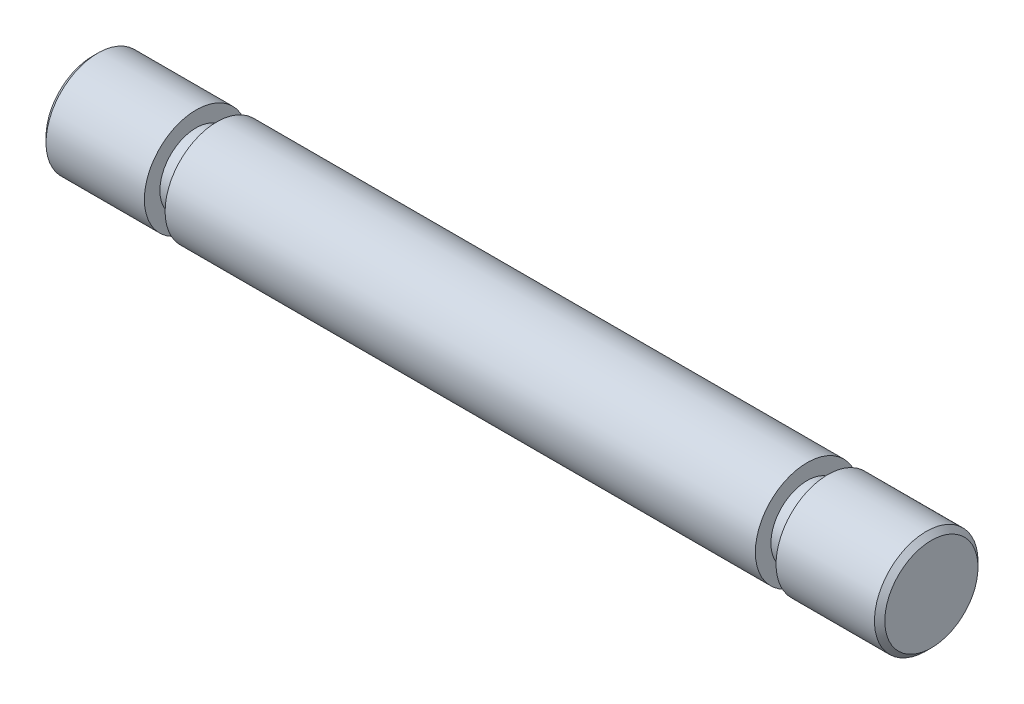
ISO-10303-21;
HEADER;
FILE_DESCRIPTION(('STEP AP214'),'2;1');
FILE_NAME('part.step','',(''),(''),'','','');
FILE_SCHEMA(('AUTOMOTIVE_DESIGN { 1 0 10303 214 1 1 1 1 }'));
ENDSEC;
DATA;
#1=APPLICATION_CONTEXT('core data for automotive mechanical design processes');
#2=APPLICATION_PROTOCOL_DEFINITION('international standard','automotive_design',2000,#1);
#3=PRODUCT_CONTEXT('',#1,'mechanical');
#4=PRODUCT('Part','Part','',(#3));
#5=PRODUCT_RELATED_PRODUCT_CATEGORY('part','',(#4));
#6=PRODUCT_DEFINITION_FORMATION('','',#4);
#7=PRODUCT_DEFINITION_CONTEXT('part definition',#1,'design');
#8=PRODUCT_DEFINITION('design','',#6,#7);
#9=PRODUCT_DEFINITION_SHAPE('','',#8);
#10=(LENGTH_UNIT() NAMED_UNIT(*) SI_UNIT(.MILLI.,.METRE.));
#11=(NAMED_UNIT(*) PLANE_ANGLE_UNIT() SI_UNIT($,.RADIAN.));
#12=(NAMED_UNIT(*) SI_UNIT($,.STERADIAN.) SOLID_ANGLE_UNIT());
#13=UNCERTAINTY_MEASURE_WITH_UNIT(LENGTH_MEASURE(1.E-05),#10,'distance_accuracy_value','');
#14=(GEOMETRIC_REPRESENTATION_CONTEXT(3) GLOBAL_UNCERTAINTY_ASSIGNED_CONTEXT((#13)) GLOBAL_UNIT_ASSIGNED_CONTEXT((#10,
#11,#12)) REPRESENTATION_CONTEXT('',''));
#15=CARTESIAN_POINT('',(0.,0.,0.));
#16=DIRECTION('',(0.,0.,1.));
#17=DIRECTION('',(1.,0.,0.));
#18=AXIS2_PLACEMENT_3D('',#15,#16,#17);
#19=CARTESIAN_POINT('',(57.,0.,0.));
#20=DIRECTION('',(-1.,0.,0.));
#21=DIRECTION('',(0.,0.,1.));
#22=AXIS2_PLACEMENT_3D('',#19,#20,#21);
#23=CYLINDRICAL_SURFACE('',#22,5.);
#24=CARTESIAN_POINT('',(57.,0.,0.));
#25=DIRECTION('',(1.,0.,0.));
#26=DIRECTION('',(0.,0.,-1.));
#27=AXIS2_PLACEMENT_3D('',#24,#25,#26);
#28=CIRCLE('',#27,5.);
#29=CARTESIAN_POINT('',(57.,0.,5.));
#30=VERTEX_POINT('',#29);
#31=EDGE_CURVE('E61',#30,#30,#28,.T.);
#32=CARTESIAN_POINT('',(0.,0.,0.));
#33=DIRECTION('',(1.,0.,0.));
#34=DIRECTION('',(0.,0.,-1.));
#35=AXIS2_PLACEMENT_3D('',#32,#33,#34);
#36=CIRCLE('',#35,5.);
#37=CARTESIAN_POINT('',(0.,0.,5.));
#38=VERTEX_POINT('',#37);
#39=EDGE_CURVE('E58',#38,#38,#36,.T.);
#40=CARTESIAN_POINT('',(57.,0.,5.));
#41=CARTESIAN_POINT('',(56.40625,0.,5.));
#42=CARTESIAN_POINT('',(55.8125,0.,5.));
#43=CARTESIAN_POINT('',(54.625,0.,5.));
#44=CARTESIAN_POINT('',(54.03125,0.,5.));
#45=CARTESIAN_POINT('',(52.84375,0.,5.));
#46=CARTESIAN_POINT('',(52.25,0.,5.));
#47=CARTESIAN_POINT('',(51.0625,0.,5.));
#48=CARTESIAN_POINT('',(50.46875,0.,5.));
#49=CARTESIAN_POINT('',(49.28125,0.,5.));
#50=CARTESIAN_POINT('',(48.6875,0.,5.));
#51=CARTESIAN_POINT('',(47.5,0.,5.));
#52=CARTESIAN_POINT('',(46.90625,0.,5.));
#53=CARTESIAN_POINT('',(45.71875,0.,5.));
#54=CARTESIAN_POINT('',(45.125,0.,5.));
#55=CARTESIAN_POINT('',(43.9375,0.,5.));
#56=CARTESIAN_POINT('',(43.34375,0.,5.));
#57=CARTESIAN_POINT('',(42.15625,0.,5.));
#58=CARTESIAN_POINT('',(41.5625,0.,5.));
#59=CARTESIAN_POINT('',(40.375,0.,5.));
#60=CARTESIAN_POINT('',(39.78125,0.,5.));
#61=CARTESIAN_POINT('',(38.59375,0.,5.));
#62=CARTESIAN_POINT('',(38.,0.,5.));
#63=CARTESIAN_POINT('',(36.8125,0.,5.));
#64=CARTESIAN_POINT('',(36.21875,0.,5.));
#65=CARTESIAN_POINT('',(35.03125,0.,5.));
#66=CARTESIAN_POINT('',(34.4375,0.,5.));
#67=CARTESIAN_POINT('',(33.25,0.,5.));
#68=CARTESIAN_POINT('',(32.65625,0.,5.));
#69=CARTESIAN_POINT('',(31.46875,0.,5.));
#70=CARTESIAN_POINT('',(30.875,0.,5.));
#71=CARTESIAN_POINT('',(29.6875,0.,5.));
#72=CARTESIAN_POINT('',(29.09375,0.,5.));
#73=CARTESIAN_POINT('',(27.90625,0.,5.));
#74=CARTESIAN_POINT('',(27.3125,0.,5.));
#75=CARTESIAN_POINT('',(26.125,0.,5.));
#76=CARTESIAN_POINT('',(25.53125,0.,5.));
#77=CARTESIAN_POINT('',(24.34375,0.,5.));
#78=CARTESIAN_POINT('',(23.75,0.,5.));
#79=CARTESIAN_POINT('',(22.5625,0.,5.));
#80=CARTESIAN_POINT('',(21.96875,0.,5.));
#81=CARTESIAN_POINT('',(20.78125,0.,5.));
#82=CARTESIAN_POINT('',(20.1875,0.,5.));
#83=CARTESIAN_POINT('',(19.,0.,5.));
#84=CARTESIAN_POINT('',(18.40625,0.,5.));
#85=CARTESIAN_POINT('',(17.21875,0.,5.));
#86=CARTESIAN_POINT('',(16.625,0.,5.));
#87=CARTESIAN_POINT('',(15.4375,0.,5.));
#88=CARTESIAN_POINT('',(14.84375,0.,5.));
#89=CARTESIAN_POINT('',(13.65625,0.,5.));
#90=CARTESIAN_POINT('',(13.0625,0.,5.));
#91=CARTESIAN_POINT('',(11.875,0.,5.));
#92=CARTESIAN_POINT('',(11.28125,0.,5.));
#93=CARTESIAN_POINT('',(10.09375,0.,5.));
#94=CARTESIAN_POINT('',(9.5,0.,5.));
#95=CARTESIAN_POINT('',(8.3125,0.,5.));
#96=CARTESIAN_POINT('',(7.71875,0.,5.));
#97=CARTESIAN_POINT('',(6.53125,0.,5.));
#98=CARTESIAN_POINT('',(5.9375,0.,5.));
#99=CARTESIAN_POINT('',(4.75,0.,5.));
#100=CARTESIAN_POINT('',(4.15625,0.,5.));
#101=CARTESIAN_POINT('',(2.96875,0.,5.));
#102=CARTESIAN_POINT('',(2.375,0.,5.));
#103=CARTESIAN_POINT('',(1.1875,0.,5.));
#104=CARTESIAN_POINT('',(0.593749999999999,0.,5.));
#105=CARTESIAN_POINT('',(0.,0.,5.));
#106=B_SPLINE_CURVE_WITH_KNOTS('',3,(#40,#41,#42,#43,#44,#45,#46,#47,#48,#49,#50,#51,#52,#53,
#54,#55,#56,#57,#58,#59,#60,#61,#62,#63,#64,#65,#66,#67,#68,#69,#70,#71,#72,#73,#74,#75,#76,#77,
#78,#79,#80,#81,#82,#83,#84,#85,#86,#87,#88,#89,#90,#91,#92,#93,#94,#95,#96,#97,#98,#99,#100,
#101,#102,#103,#104,#105),.UNSPECIFIED.,.F.,.F.,(4,2,2,2,2,2,2,2,2,2,2,2,2,2,2,2,2,2,2,2,2,2,2,
2,2,2,2,2,2,2,2,2,4),(0.,1.78125,3.5625,5.34374999999999,7.12499999999999,8.90625,10.6875,
12.46875,14.25,16.03125,17.8125,19.59375,21.375,23.15625,24.9375,26.71875,28.5,30.28125,32.0625,
33.84375,35.625,37.40625,39.1875,40.96875,42.75,44.53125,46.3125,48.09375,49.875,51.65625,
53.4375,55.21875,57.),.UNSPECIFIED.);
#107=EDGE_CURVE('BSEAM36',#30,#38,#106,.T.);
#108=ORIENTED_EDGE('',*,*,#31,.F.);
#109=ORIENTED_EDGE('',*,*,#39,.T.);
#110=ORIENTED_EDGE('',*,*,#107,.T.);
#111=ORIENTED_EDGE('',*,*,#107,.F.);
#112=EDGE_LOOP('',(#108,#110,#109,#111));
#113=FACE_BOUND('',#112,.T.);
#114=ADVANCED_FACE('F36',(#113),#23,.T.);
#115=CARTESIAN_POINT('',(57.,0.,0.));
#116=DIRECTION('',(1.,0.,0.));
#117=DIRECTION('',(0.,0.,-1.));
#118=AXIS2_PLACEMENT_3D('',#115,#116,#117);
#119=PLANE('',#118);
#120=CARTESIAN_POINT('',(57.,0.,0.));
#121=DIRECTION('',(1.,0.,0.));
#122=DIRECTION('',(0.,0.,-1.));
#123=AXIS2_PLACEMENT_3D('',#120,#121,#122);
#124=CIRCLE('',#123,3.5);
#125=CARTESIAN_POINT('',(57.,0.,-3.5));
#126=VERTEX_POINT('',#125);
#127=EDGE_CURVE('E57',#126,#126,#124,.T.);
#128=ORIENTED_EDGE('',*,*,#127,.F.);
#129=EDGE_LOOP('',(#128));
#130=FACE_BOUND('',#129,.T.);
#131=ORIENTED_EDGE('',*,*,#31,.T.);
#132=EDGE_LOOP('',(#131));
#133=FACE_BOUND('',#132,.T.);
#134=ADVANCED_FACE('F98',(#130,#133),#119,.T.);
#135=CARTESIAN_POINT('',(0.,0.,0.));
#136=DIRECTION('',(1.,0.,0.));
#137=DIRECTION('',(0.,0.,-1.));
#138=AXIS2_PLACEMENT_3D('',#135,#136,#137);
#139=PLANE('',#138);
#140=CARTESIAN_POINT('',(0.,0.,0.));
#141=DIRECTION('',(-1.,0.,0.));
#142=DIRECTION('',(0.,0.,1.));
#143=AXIS2_PLACEMENT_3D('',#140,#141,#142);
#144=CIRCLE('',#143,3.5);
#145=CARTESIAN_POINT('',(0.,0.,3.5));
#146=VERTEX_POINT('',#145);
#147=EDGE_CURVE('E65',#146,#146,#144,.T.);
#148=ORIENTED_EDGE('',*,*,#147,.F.);
#149=EDGE_LOOP('',(#148));
#150=FACE_BOUND('',#149,.T.);
#151=ORIENTED_EDGE('',*,*,#39,.F.);
#152=EDGE_LOOP('',(#151));
#153=FACE_BOUND('',#152,.T.);
#154=ADVANCED_FACE('F104',(#150,#153),#139,.F.);
#155=CARTESIAN_POINT('',(-2.,0.,0.));
#156=DIRECTION('',(1.,0.,0.));
#157=DIRECTION('',(0.,0.,-1.));
#158=AXIS2_PLACEMENT_3D('',#155,#156,#157);
#159=CYLINDRICAL_SURFACE('',#158,3.5);
#160=CARTESIAN_POINT('',(-2.,0.,0.));
#161=DIRECTION('',(-1.,0.,0.));
#162=DIRECTION('',(0.,0.,1.));
#163=AXIS2_PLACEMENT_3D('',#160,#161,#162);
#164=CIRCLE('',#163,3.5);
#165=CARTESIAN_POINT('',(-2.,0.,3.5));
#166=VERTEX_POINT('',#165);
#167=EDGE_CURVE('E62',#166,#166,#164,.T.);
#168=ORIENTED_EDGE('',*,*,#167,.F.);
#169=EDGE_LOOP('',(#168));
#170=FACE_BOUND('',#169,.T.);
#171=ORIENTED_EDGE('',*,*,#147,.T.);
#172=EDGE_LOOP('',(#171));
#173=FACE_BOUND('',#172,.T.);
#174=ADVANCED_FACE('F116',(#170,#173),#159,.T.);
#175=CARTESIAN_POINT('',(-12.,0.,0.));
#176=DIRECTION('',(1.,0.,0.));
#177=DIRECTION('',(0.,0.,-1.));
#178=AXIS2_PLACEMENT_3D('',#175,#176,#177);
#179=CYLINDRICAL_SURFACE('',#178,5.);
#180=CARTESIAN_POINT('',(-11.5,0.,0.));
#181=DIRECTION('',(-1.,0.,0.));
#182=DIRECTION('',(0.,0.,1.));
#183=AXIS2_PLACEMENT_3D('',#180,#181,#182);
#184=CIRCLE('',#183,5.);
#185=CARTESIAN_POINT('',(-11.5,0.,5.));
#186=VERTEX_POINT('',#185);
#187=EDGE_CURVE('E48',#186,#186,#184,.F.);
#188=ORIENTED_EDGE('',*,*,#187,.T.);
#189=EDGE_LOOP('',(#188));
#190=FACE_BOUND('',#189,.T.);
#191=CARTESIAN_POINT('',(-2.,0.,0.));
#192=DIRECTION('',(-1.,0.,0.));
#193=DIRECTION('',(0.,0.,1.));
#194=AXIS2_PLACEMENT_3D('',#191,#192,#193);
#195=CIRCLE('',#194,5.);
#196=CARTESIAN_POINT('',(-2.,0.,5.));
#197=VERTEX_POINT('',#196);
#198=EDGE_CURVE('E70',#197,#197,#195,.T.);
#199=ORIENTED_EDGE('',*,*,#198,.T.);
#200=EDGE_LOOP('',(#199));
#201=FACE_BOUND('',#200,.T.);
#202=ADVANCED_FACE('F121',(#190,#201),#179,.T.);
#203=CARTESIAN_POINT('',(-12.,0.,0.));
#204=DIRECTION('',(-1.,0.,0.));
#205=DIRECTION('',(0.,0.,1.));
#206=AXIS2_PLACEMENT_3D('',#203,#204,#205);
#207=PLANE('',#206);
#208=CARTESIAN_POINT('',(-12.,0.,0.));
#209=DIRECTION('',(-1.,0.,0.));
#210=DIRECTION('',(0.,0.,1.));
#211=AXIS2_PLACEMENT_3D('',#208,#209,#210);
#212=CIRCLE('',#211,4.5);
#213=CARTESIAN_POINT('',(-12.,0.,4.5));
#214=VERTEX_POINT('',#213);
#215=EDGE_CURVE('E52',#214,#214,#212,.T.);
#216=ORIENTED_EDGE('',*,*,#215,.T.);
#217=EDGE_LOOP('',(#216));
#218=FACE_BOUND('',#217,.T.);
#219=ADVANCED_FACE('F125',(#218),#207,.T.);
#220=CARTESIAN_POINT('',(-2.,0.,0.));
#221=DIRECTION('',(-1.,0.,0.));
#222=DIRECTION('',(0.,0.,1.));
#223=AXIS2_PLACEMENT_3D('',#220,#221,#222);
#224=PLANE('',#223);
#225=ORIENTED_EDGE('',*,*,#167,.T.);
#226=EDGE_LOOP('',(#225));
#227=FACE_BOUND('',#226,.T.);
#228=ORIENTED_EDGE('',*,*,#198,.F.);
#229=EDGE_LOOP('',(#228));
#230=FACE_BOUND('',#229,.T.);
#231=ADVANCED_FACE('F127',(#227,#230),#224,.F.);
#232=CARTESIAN_POINT('',(59.,0.,0.));
#233=DIRECTION('',(-1.,0.,0.));
#234=DIRECTION('',(0.,0.,1.));
#235=AXIS2_PLACEMENT_3D('',#232,#233,#234);
#236=CYLINDRICAL_SURFACE('',#235,3.5);
#237=CARTESIAN_POINT('',(59.,0.,0.));
#238=DIRECTION('',(1.,0.,0.));
#239=DIRECTION('',(0.,0.,-1.));
#240=AXIS2_PLACEMENT_3D('',#237,#238,#239);
#241=CIRCLE('',#240,3.5);
#242=CARTESIAN_POINT('',(59.,0.,-3.5));
#243=VERTEX_POINT('',#242);
#244=EDGE_CURVE('E73',#243,#243,#241,.T.);
#245=ORIENTED_EDGE('',*,*,#244,.F.);
#246=EDGE_LOOP('',(#245));
#247=FACE_BOUND('',#246,.T.);
#248=ORIENTED_EDGE('',*,*,#127,.T.);
#249=EDGE_LOOP('',(#248));
#250=FACE_BOUND('',#249,.T.);
#251=ADVANCED_FACE('F130',(#247,#250),#236,.T.);
#252=CARTESIAN_POINT('',(69.,0.,0.));
#253=DIRECTION('',(-1.,0.,0.));
#254=DIRECTION('',(0.,0.,1.));
#255=AXIS2_PLACEMENT_3D('',#252,#253,#254);
#256=CYLINDRICAL_SURFACE('',#255,5.);
#257=CARTESIAN_POINT('',(68.5,0.,0.));
#258=DIRECTION('',(1.,0.,0.));
#259=DIRECTION('',(0.,0.,-1.));
#260=AXIS2_PLACEMENT_3D('',#257,#258,#259);
#261=CIRCLE('',#260,5.);
#262=CARTESIAN_POINT('',(68.5,0.,-5.));
#263=VERTEX_POINT('',#262);
#264=EDGE_CURVE('E10',#263,#263,#261,.F.);
#265=ORIENTED_EDGE('',*,*,#264,.T.);
#266=EDGE_LOOP('',(#265));
#267=FACE_BOUND('',#266,.T.);
#268=CARTESIAN_POINT('',(59.,0.,0.));
#269=DIRECTION('',(1.,0.,0.));
#270=DIRECTION('',(0.,0.,-1.));
#271=AXIS2_PLACEMENT_3D('',#268,#269,#270);
#272=CIRCLE('',#271,5.);
#273=CARTESIAN_POINT('',(59.,0.,-5.));
#274=VERTEX_POINT('',#273);
#275=EDGE_CURVE('E78',#274,#274,#272,.T.);
#276=ORIENTED_EDGE('',*,*,#275,.T.);
#277=EDGE_LOOP('',(#276));
#278=FACE_BOUND('',#277,.T.);
#279=ADVANCED_FACE('F82',(#267,#278),#256,.T.);
#280=CARTESIAN_POINT('',(69.,0.,0.));
#281=DIRECTION('',(1.,0.,0.));
#282=DIRECTION('',(0.,0.,-1.));
#283=AXIS2_PLACEMENT_3D('',#280,#281,#282);
#284=PLANE('',#283);
#285=CARTESIAN_POINT('',(69.,0.,0.));
#286=DIRECTION('',(1.,0.,0.));
#287=DIRECTION('',(0.,0.,-1.));
#288=AXIS2_PLACEMENT_3D('',#285,#286,#287);
#289=CIRCLE('',#288,4.5);
#290=CARTESIAN_POINT('',(69.,0.,-4.5));
#291=VERTEX_POINT('',#290);
#292=EDGE_CURVE('E44',#291,#291,#289,.T.);
#293=ORIENTED_EDGE('',*,*,#292,.T.);
#294=EDGE_LOOP('',(#293));
#295=FACE_BOUND('',#294,.T.);
#296=ADVANCED_FACE('F87',(#295),#284,.T.);
#297=CARTESIAN_POINT('',(59.,0.,0.));
#298=DIRECTION('',(1.,0.,0.));
#299=DIRECTION('',(0.,0.,-1.));
#300=AXIS2_PLACEMENT_3D('',#297,#298,#299);
#301=PLANE('',#300);
#302=ORIENTED_EDGE('',*,*,#244,.T.);
#303=EDGE_LOOP('',(#302));
#304=FACE_BOUND('',#303,.T.);
#305=ORIENTED_EDGE('',*,*,#275,.F.);
#306=EDGE_LOOP('',(#305));
#307=FACE_BOUND('',#306,.T.);
#308=ADVANCED_FACE('F84',(#304,#307),#301,.F.);
#309=CARTESIAN_POINT('',(-12.,0.,0.));
#310=DIRECTION('',(1.,0.,0.));
#311=DIRECTION('',(0.,0.,-1.));
#312=AXIS2_PLACEMENT_3D('',#309,#310,#311);
#313=CONICAL_SURFACE('',#312,4.5,0.785398163397444);
#314=ORIENTED_EDGE('',*,*,#187,.F.);
#315=EDGE_LOOP('',(#314));
#316=FACE_BOUND('',#315,.T.);
#317=ORIENTED_EDGE('',*,*,#215,.F.);
#318=EDGE_LOOP('',(#317));
#319=FACE_BOUND('',#318,.T.);
#320=ADVANCED_FACE('F86',(#316,#319),#313,.T.);
#321=CARTESIAN_POINT('',(69.,0.,0.));
#322=DIRECTION('',(-1.,0.,0.));
#323=DIRECTION('',(0.,0.,1.));
#324=AXIS2_PLACEMENT_3D('',#321,#322,#323);
#325=CONICAL_SURFACE('',#324,4.5,0.785398163397444);
#326=ORIENTED_EDGE('',*,*,#264,.F.);
#327=EDGE_LOOP('',(#326));
#328=FACE_BOUND('',#327,.T.);
#329=ORIENTED_EDGE('',*,*,#292,.F.);
#330=EDGE_LOOP('',(#329));
#331=FACE_BOUND('',#330,.T.);
#332=ADVANCED_FACE('F39',(#328,#331),#325,.T.);
#333=CLOSED_SHELL('',(#114,#134,#154,#174,#202,#219,#231,#251,#279,#296,#308,#320,#332));
#334=MANIFOLD_SOLID_BREP('B2',#333);
#335=ADVANCED_BREP_SHAPE_REPRESENTATION('',(#18,#334),#14);
#336=SHAPE_DEFINITION_REPRESENTATION(#9,#335);
ENDSEC;
END-ISO-10303-21;
